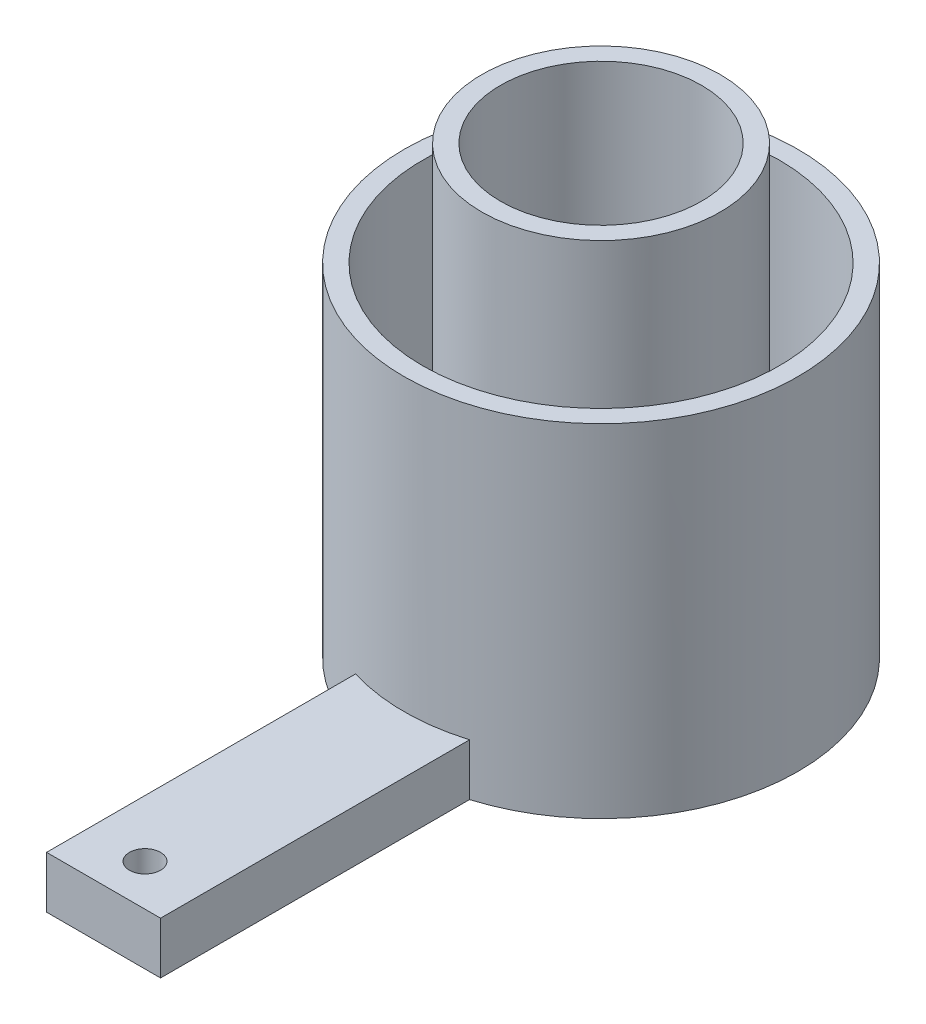
ISO-10303-21;
HEADER;
FILE_DESCRIPTION(('STEP AP214'),'2;1');
FILE_NAME('part.step','',(''),(''),'','','');
FILE_SCHEMA(('AUTOMOTIVE_DESIGN { 1 0 10303 214 1 1 1 1 }'));
ENDSEC;
DATA;
#1=APPLICATION_CONTEXT('core data for automotive mechanical design processes');
#2=APPLICATION_PROTOCOL_DEFINITION('international standard','automotive_design',2000,#1);
#3=PRODUCT_CONTEXT('',#1,'mechanical');
#4=PRODUCT('Part','Part','',(#3));
#5=PRODUCT_RELATED_PRODUCT_CATEGORY('part','',(#4));
#6=PRODUCT_DEFINITION_FORMATION('','',#4);
#7=PRODUCT_DEFINITION_CONTEXT('part definition',#1,'design');
#8=PRODUCT_DEFINITION('design','',#6,#7);
#9=PRODUCT_DEFINITION_SHAPE('','',#8);
#10=(LENGTH_UNIT() NAMED_UNIT(*) SI_UNIT(.MILLI.,.METRE.));
#11=(NAMED_UNIT(*) PLANE_ANGLE_UNIT() SI_UNIT($,.RADIAN.));
#12=(NAMED_UNIT(*) SI_UNIT($,.STERADIAN.) SOLID_ANGLE_UNIT());
#13=UNCERTAINTY_MEASURE_WITH_UNIT(LENGTH_MEASURE(1.E-05),#10,'distance_accuracy_value','');
#14=(GEOMETRIC_REPRESENTATION_CONTEXT(3) GLOBAL_UNCERTAINTY_ASSIGNED_CONTEXT((#13)) GLOBAL_UNIT_ASSIGNED_CONTEXT((#10,
#11,#12)) REPRESENTATION_CONTEXT('',''));
#15=CARTESIAN_POINT('',(0.,0.,0.));
#16=DIRECTION('',(0.,0.,1.));
#17=DIRECTION('',(1.,0.,0.));
#18=AXIS2_PLACEMENT_3D('',#15,#16,#17);
#19=CARTESIAN_POINT('',(0.,33.,0.));
#20=DIRECTION('',(0.,-1.,0.));
#21=DIRECTION('',(0.,0.,-1.));
#22=AXIS2_PLACEMENT_3D('',#19,#20,#21);
#23=CYLINDRICAL_SURFACE('',#22,17.2);
#24=CARTESIAN_POINT('',(0.,10.,0.));
#25=DIRECTION('',(0.,-1.,0.));
#26=DIRECTION('',(0.,0.,-1.));
#27=AXIS2_PLACEMENT_3D('',#24,#25,#26);
#28=CIRCLE('',#27,17.2);
#29=CARTESIAN_POINT('',(0.,10.,-17.2));
#30=VERTEX_POINT('',#29);
#31=EDGE_CURVE('E268',#30,#30,#28,.T.);
#32=ORIENTED_EDGE('',*,*,#31,.F.);
#33=EDGE_LOOP('',(#32));
#34=FACE_BOUND('',#33,.T.);
#35=CARTESIAN_POINT('',(0.,5.,0.));
#36=DIRECTION('',(0.,-1.,0.));
#37=DIRECTION('',(0.,0.,-1.));
#38=AXIS2_PLACEMENT_3D('',#35,#36,#37);
#39=CIRCLE('',#38,17.2);
#40=CARTESIAN_POINT('',(5.5,5.,16.2969322266493));
#41=VERTEX_POINT('',#40);
#42=CARTESIAN_POINT('',(-5.5,5.,16.2969322266493));
#43=VERTEX_POINT('',#42);
#44=EDGE_CURVE('E181',#41,#43,#39,.T.);
#45=ORIENTED_EDGE('',*,*,#44,.T.);
#46=DIRECTION('',(0.,-1.,0.));
#47=VECTOR('',#46,1.);
#48=CARTESIAN_POINT('',(-5.5,33.,16.2969322266493));
#49=LINE('',#48,#47);
#50=CARTESIAN_POINT('',(-5.5,0.,16.2969322266493));
#51=VERTEX_POINT('',#50);
#52=EDGE_CURVE('E189',#43,#51,#49,.T.);
#53=ORIENTED_EDGE('',*,*,#52,.T.);
#54=CARTESIAN_POINT('',(0.,0.,0.));
#55=DIRECTION('',(0.,1.,0.));
#56=DIRECTION('',(0.,0.,1.));
#57=AXIS2_PLACEMENT_3D('',#54,#55,#56);
#58=CIRCLE('',#57,17.2);
#59=CARTESIAN_POINT('',(-13.4339705934385,0.,-10.7409698861243));
#60=VERTEX_POINT('',#59);
#61=EDGE_CURVE('E269',#60,#51,#58,.T.);
#62=ORIENTED_EDGE('',*,*,#61,.F.);
#63=DIRECTION('',(0.,-1.,0.));
#64=VECTOR('',#63,1.);
#65=CARTESIAN_POINT('',(-13.4339705934385,33.,-10.7409698861243));
#66=LINE('',#65,#64);
#67=CARTESIAN_POINT('',(-13.4339705934385,2.4,-10.7409698861243));
#68=VERTEX_POINT('',#67);
#69=EDGE_CURVE('E228',#68,#60,#66,.T.);
#70=ORIENTED_EDGE('',*,*,#69,.F.);
#71=CARTESIAN_POINT('',(0.,2.4,0.));
#72=DIRECTION('',(0.,-1.,0.));
#73=DIRECTION('',(0.,0.,-1.));
#74=AXIS2_PLACEMENT_3D('',#71,#72,#73);
#75=CIRCLE('',#74,17.2);
#76=CARTESIAN_POINT('',(-6.92620660055423,2.4,-15.7438134556542));
#77=VERTEX_POINT('',#76);
#78=EDGE_CURVE('E234',#68,#77,#75,.T.);
#79=ORIENTED_EDGE('',*,*,#78,.T.);
#80=DIRECTION('',(0.,-1.,0.));
#81=VECTOR('',#80,1.);
#82=CARTESIAN_POINT('',(-6.92620660055423,33.,-15.7438134556542));
#83=LINE('',#82,#81);
#84=CARTESIAN_POINT('',(-6.92620660055423,0.,-15.7438134556542));
#85=VERTEX_POINT('',#84);
#86=EDGE_CURVE('E220',#85,#77,#83,.F.);
#87=ORIENTED_EDGE('',*,*,#86,.F.);
#88=CARTESIAN_POINT('',(5.5,0.,16.2969322266493));
#89=VERTEX_POINT('',#88);
#90=EDGE_CURVE('E260',#89,#85,#58,.T.);
#91=ORIENTED_EDGE('',*,*,#90,.F.);
#92=DIRECTION('',(0.,-1.,0.));
#93=VECTOR('',#92,1.);
#94=CARTESIAN_POINT('',(5.5,33.,16.2969322266493));
#95=LINE('',#94,#93);
#96=EDGE_CURVE('E185',#41,#89,#95,.T.);
#97=ORIENTED_EDGE('',*,*,#96,.F.);
#98=EDGE_LOOP('',(#45,#53,#62,#70,#79,#87,#91,#97));
#99=FACE_BOUND('',#98,.T.);
#100=ADVANCED_FACE('F39',(#34,#99),#23,.F.);
#101=CARTESIAN_POINT('',(0.,33.,0.));
#102=DIRECTION('',(0.,-1.,0.));
#103=DIRECTION('',(0.,0.,-1.));
#104=AXIS2_PLACEMENT_3D('',#101,#102,#103);
#105=CYLINDRICAL_SURFACE('',#104,19.);
#106=CARTESIAN_POINT('',(0.,33.,0.));
#107=DIRECTION('',(0.,1.,0.));
#108=DIRECTION('',(0.,0.,1.));
#109=AXIS2_PLACEMENT_3D('',#106,#107,#108);
#110=CIRCLE('',#109,19.);
#111=CARTESIAN_POINT('',(0.,33.,19.));
#112=VERTEX_POINT('',#111);
#113=EDGE_CURVE('E264',#112,#112,#110,.T.);
#114=ORIENTED_EDGE('',*,*,#113,.F.);
#115=EDGE_LOOP('',(#114));
#116=FACE_BOUND('',#115,.T.);
#117=DIRECTION('',(0.,-1.,0.));
#118=VECTOR('',#117,1.);
#119=CARTESIAN_POINT('',(-5.5,33.,18.1865334794732));
#120=LINE('',#119,#118);
#121=CARTESIAN_POINT('',(-5.5,5.,18.1865334794732));
#122=VERTEX_POINT('',#121);
#123=CARTESIAN_POINT('',(-5.5,0.,18.1865334794732));
#124=VERTEX_POINT('',#123);
#125=EDGE_CURVE('E54',#122,#124,#120,.T.);
#126=ORIENTED_EDGE('',*,*,#125,.F.);
#127=CARTESIAN_POINT('',(0.,5.,0.));
#128=DIRECTION('',(0.,-1.,0.));
#129=DIRECTION('',(0.,0.,-1.));
#130=AXIS2_PLACEMENT_3D('',#127,#128,#129);
#131=CIRCLE('',#130,19.);
#132=CARTESIAN_POINT('',(5.5,5.,18.1865334794732));
#133=VERTEX_POINT('',#132);
#134=EDGE_CURVE('E58',#133,#122,#131,.T.);
#135=ORIENTED_EDGE('',*,*,#134,.F.);
#136=DIRECTION('',(0.,-1.,0.));
#137=VECTOR('',#136,1.);
#138=CARTESIAN_POINT('',(5.5,33.,18.1865334794732));
#139=LINE('',#138,#137);
#140=CARTESIAN_POINT('',(5.5,0.,18.1865334794732));
#141=VERTEX_POINT('',#140);
#142=EDGE_CURVE('E158',#133,#141,#139,.T.);
#143=ORIENTED_EDGE('',*,*,#142,.T.);
#144=CARTESIAN_POINT('',(0.,0.,0.));
#145=DIRECTION('',(0.,1.,0.));
#146=DIRECTION('',(0.,0.,1.));
#147=AXIS2_PLACEMENT_3D('',#144,#145,#146);
#148=CIRCLE('',#147,19.);
#149=EDGE_CURVE('E265',#141,#124,#148,.T.);
#150=ORIENTED_EDGE('',*,*,#149,.T.);
#151=EDGE_LOOP('',(#126,#135,#143,#150));
#152=FACE_BOUND('',#151,.T.);
#153=ADVANCED_FACE('F322',(#116,#152),#105,.T.);
#154=CARTESIAN_POINT('',(0.,43.,0.));
#155=DIRECTION('',(0.,-1.,0.));
#156=DIRECTION('',(0.,0.,-1.));
#157=AXIS2_PLACEMENT_3D('',#154,#155,#156);
#158=CYLINDRICAL_SURFACE('',#157,11.5);
#159=CARTESIAN_POINT('',(0.,10.,0.));
#160=DIRECTION('',(0.,-1.,0.));
#161=DIRECTION('',(0.,0.,-1.));
#162=AXIS2_PLACEMENT_3D('',#159,#160,#161);
#163=CIRCLE('',#162,11.5);
#164=CARTESIAN_POINT('',(0.,10.,-11.5));
#165=VERTEX_POINT('',#164);
#166=EDGE_CURVE('E245',#165,#165,#163,.F.);
#167=ORIENTED_EDGE('',*,*,#166,.F.);
#168=EDGE_LOOP('',(#167));
#169=FACE_BOUND('',#168,.T.);
#170=DIRECTION('',(0.,-1.,0.));
#171=VECTOR('',#170,1.);
#172=CARTESIAN_POINT('',(-5.5,43.,10.0995049383621));
#173=LINE('',#172,#171);
#174=CARTESIAN_POINT('',(-5.5,5.,10.0995049383621));
#175=VERTEX_POINT('',#174);
#176=CARTESIAN_POINT('',(-5.5,0.,10.0995049383621));
#177=VERTEX_POINT('',#176);
#178=EDGE_CURVE('E11',#175,#177,#173,.T.);
#179=ORIENTED_EDGE('',*,*,#178,.F.);
#180=CARTESIAN_POINT('',(0.,5.,0.));
#181=DIRECTION('',(0.,-1.,0.));
#182=DIRECTION('',(0.,0.,-1.));
#183=AXIS2_PLACEMENT_3D('',#180,#181,#182);
#184=CIRCLE('',#183,11.5);
#185=CARTESIAN_POINT('',(5.5,5.,10.0995049383621));
#186=VERTEX_POINT('',#185);
#187=EDGE_CURVE('E281',#186,#175,#184,.T.);
#188=ORIENTED_EDGE('',*,*,#187,.F.);
#189=DIRECTION('',(0.,-1.,0.));
#190=VECTOR('',#189,1.);
#191=CARTESIAN_POINT('',(5.5,43.,10.0995049383621));
#192=LINE('',#191,#190);
#193=CARTESIAN_POINT('',(5.5,0.,10.0995049383621));
#194=VERTEX_POINT('',#193);
#195=EDGE_CURVE('E47',#186,#194,#192,.T.);
#196=ORIENTED_EDGE('',*,*,#195,.T.);
#197=CARTESIAN_POINT('',(0.,0.,0.));
#198=DIRECTION('',(0.,1.,0.));
#199=DIRECTION('',(0.,0.,1.));
#200=AXIS2_PLACEMENT_3D('',#197,#198,#199);
#201=CIRCLE('',#200,11.5);
#202=CARTESIAN_POINT('',(-5.01101741859494,0.,-10.3508310985417));
#203=VERTEX_POINT('',#202);
#204=EDGE_CURVE('E247',#194,#203,#201,.T.);
#205=ORIENTED_EDGE('',*,*,#204,.T.);
#206=DIRECTION('',(0.,-1.,0.));
#207=VECTOR('',#206,1.);
#208=CARTESIAN_POINT('',(-5.01101741859494,43.,-10.3508310985417));
#209=LINE('',#208,#207);
#210=CARTESIAN_POINT('',(-5.01101741859494,2.4,-10.3508310985417));
#211=VERTEX_POINT('',#210);
#212=EDGE_CURVE('E214',#203,#211,#209,.F.);
#213=ORIENTED_EDGE('',*,*,#212,.T.);
#214=CARTESIAN_POINT('',(0.,2.4,0.));
#215=DIRECTION('',(0.,-1.,0.));
#216=DIRECTION('',(0.,0.,-1.));
#217=AXIS2_PLACEMENT_3D('',#214,#215,#216);
#218=CIRCLE('',#217,11.5);
#219=CARTESIAN_POINT('',(-8.71463450240619,2.4,-7.50367546536173));
#220=VERTEX_POINT('',#219);
#221=EDGE_CURVE('E255',#220,#211,#218,.T.);
#222=ORIENTED_EDGE('',*,*,#221,.F.);
#223=DIRECTION('',(0.,-1.,0.));
#224=VECTOR('',#223,1.);
#225=CARTESIAN_POINT('',(-8.71463450240619,43.,-7.50367546536173));
#226=LINE('',#225,#224);
#227=CARTESIAN_POINT('',(-8.71463450240619,0.,-7.50367546536173));
#228=VERTEX_POINT('',#227);
#229=EDGE_CURVE('E222',#220,#228,#226,.T.);
#230=ORIENTED_EDGE('',*,*,#229,.T.);
#231=EDGE_CURVE('E242',#228,#177,#201,.T.);
#232=ORIENTED_EDGE('',*,*,#231,.T.);
#233=EDGE_LOOP('',(#179,#188,#196,#205,#213,#222,#230,#232));
#234=FACE_BOUND('',#233,.T.);
#235=ADVANCED_FACE('F288',(#169,#234),#158,.T.);
#236=CARTESIAN_POINT('',(0.,33.,0.));
#237=DIRECTION('',(0.,1.,0.));
#238=DIRECTION('',(0.,0.,1.));
#239=AXIS2_PLACEMENT_3D('',#236,#237,#238);
#240=CIRCLE('',#239,17.2);
#241=CARTESIAN_POINT('',(0.,33.,17.2));
#242=VERTEX_POINT('',#241);
#243=EDGE_CURVE('E261',#242,#242,#240,.T.);
#244=ORIENTED_EDGE('',*,*,#243,.T.);
#245=EDGE_LOOP('',(#244));
#246=FACE_BOUND('',#245,.T.);
#247=CARTESIAN_POINT('',(0.,13.,0.));
#248=DIRECTION('',(0.,-1.,0.));
#249=DIRECTION('',(0.,0.,-1.));
#250=AXIS2_PLACEMENT_3D('',#247,#248,#249);
#251=CIRCLE('',#250,17.2);
#252=CARTESIAN_POINT('',(0.,13.,-17.2));
#253=VERTEX_POINT('',#252);
#254=EDGE_CURVE('E257',#253,#253,#251,.T.);
#255=ORIENTED_EDGE('',*,*,#254,.T.);
#256=EDGE_LOOP('',(#255));
#257=FACE_BOUND('',#256,.T.);
#258=ADVANCED_FACE('F324',(#246,#257),#23,.F.);
#259=CARTESIAN_POINT('',(0.,33.,0.));
#260=DIRECTION('',(0.,1.,0.));
#261=DIRECTION('',(0.,0.,1.));
#262=AXIS2_PLACEMENT_3D('',#259,#260,#261);
#263=PLANE('',#262);
#264=ORIENTED_EDGE('',*,*,#243,.F.);
#265=EDGE_LOOP('',(#264));
#266=FACE_BOUND('',#265,.T.);
#267=ORIENTED_EDGE('',*,*,#113,.T.);
#268=EDGE_LOOP('',(#267));
#269=FACE_BOUND('',#268,.T.);
#270=ADVANCED_FACE('F332',(#266,#269),#263,.T.);
#271=CARTESIAN_POINT('',(0.,0.,0.));
#272=DIRECTION('',(0.,1.,0.));
#273=DIRECTION('',(0.,0.,1.));
#274=AXIS2_PLACEMENT_3D('',#271,#272,#273);
#275=PLANE('',#274);
#276=CARTESIAN_POINT('',(0.,0.,44.));
#277=DIRECTION('',(0.,-1.,0.));
#278=DIRECTION('',(0.,0.,-1.));
#279=AXIS2_PLACEMENT_3D('',#276,#277,#278);
#280=CIRCLE('',#279,1.5);
#281=CARTESIAN_POINT('',(0.,0.,42.5));
#282=VERTEX_POINT('',#281);
#283=EDGE_CURVE('E305',#282,#282,#280,.T.);
#284=ORIENTED_EDGE('',*,*,#283,.F.);
#285=EDGE_LOOP('',(#284));
#286=FACE_BOUND('',#285,.T.);
#287=ORIENTED_EDGE('',*,*,#61,.T.);
#288=DIRECTION('',(0.,0.,1.));
#289=VECTOR('',#288,1.);
#290=CARTESIAN_POINT('',(-5.5,0.,0.));
#291=LINE('',#290,#289);
#292=EDGE_CURVE('E300',#177,#51,#291,.T.);
#293=ORIENTED_EDGE('',*,*,#292,.F.);
#294=ORIENTED_EDGE('',*,*,#231,.F.);
#295=DIRECTION('',(-0.824632815792926,0.,-0.565668382639006));
#296=VECTOR('',#295,1.);
#297=CARTESIAN_POINT('',(-14.9219179053918,0.,-11.7616480998518));
#298=LINE('',#297,#296);
#299=EDGE_CURVE('E210',#228,#60,#298,.T.);
#300=ORIENTED_EDGE('',*,*,#299,.T.);
#301=EDGE_LOOP('',(#287,#293,#294,#300));
#302=FACE_BOUND('',#301,.T.);
#303=DIRECTION('',(0.,0.,1.));
#304=VECTOR('',#303,1.);
#305=CARTESIAN_POINT('',(5.5,0.,0.));
#306=LINE('',#305,#304);
#307=EDGE_CURVE('E293',#194,#89,#306,.T.);
#308=ORIENTED_EDGE('',*,*,#307,.T.);
#309=ORIENTED_EDGE('',*,*,#90,.T.);
#310=DIRECTION('',(0.334650429092405,0.,0.942342342415042));
#311=VECTOR('',#310,1.);
#312=CARTESIAN_POINT('',(-3.56545480144874,0.,-6.28027046473769));
#313=LINE('',#312,#311);
#314=EDGE_CURVE('E206',#85,#203,#313,.T.);
#315=ORIENTED_EDGE('',*,*,#314,.T.);
#316=ORIENTED_EDGE('',*,*,#204,.F.);
#317=EDGE_LOOP('',(#308,#309,#315,#316));
#318=FACE_BOUND('',#317,.T.);
#319=CARTESIAN_POINT('',(0.,0.,0.));
#320=DIRECTION('',(0.,1.,0.));
#321=DIRECTION('',(0.,0.,1.));
#322=AXIS2_PLACEMENT_3D('',#319,#320,#321);
#323=CIRCLE('',#322,9.7);
#324=CARTESIAN_POINT('',(-7.21964860347408,0.,-6.47816903471611));
#325=VERTEX_POINT('',#324);
#326=CARTESIAN_POINT('',(-4.40432597607253,0.,-8.64244830453112));
#327=VERTEX_POINT('',#326);
#328=EDGE_CURVE('E237',#325,#327,#323,.T.);
#329=ORIENTED_EDGE('',*,*,#328,.T.);
#330=CARTESIAN_POINT('',(-3.56545480144874,0.,-6.28027046473769));
#331=VERTEX_POINT('',#330);
#332=EDGE_CURVE('E192',#327,#331,#313,.T.);
#333=ORIENTED_EDGE('',*,*,#332,.T.);
#334=DIRECTION('',(-0.792808155570245,0.,0.609471269594642));
#335=VECTOR('',#334,1.);
#336=CARTESIAN_POINT('',(-5.1525342695895,0.,-5.06020312360444));
#337=LINE('',#336,#335);
#338=CARTESIAN_POINT('',(-5.1525342695895,0.,-5.06020312360444));
#339=VERTEX_POINT('',#338);
#340=EDGE_CURVE('E207',#331,#339,#337,.T.);
#341=ORIENTED_EDGE('',*,*,#340,.T.);
#342=EDGE_CURVE('E196',#339,#325,#298,.T.);
#343=ORIENTED_EDGE('',*,*,#342,.T.);
#344=EDGE_LOOP('',(#329,#333,#341,#343));
#345=FACE_BOUND('',#344,.T.);
#346=ORIENTED_EDGE('',*,*,#149,.F.);
#347=CARTESIAN_POINT('',(5.5,0.,48.));
#348=VERTEX_POINT('',#347);
#349=EDGE_CURVE('E298',#141,#348,#306,.T.);
#350=ORIENTED_EDGE('',*,*,#349,.T.);
#351=DIRECTION('',(1.,0.,0.));
#352=VECTOR('',#351,1.);
#353=CARTESIAN_POINT('',(0.,0.,48.));
#354=LINE('',#353,#352);
#355=CARTESIAN_POINT('',(-5.5,0.,48.));
#356=VERTEX_POINT('',#355);
#357=EDGE_CURVE('E174',#356,#348,#354,.T.);
#358=ORIENTED_EDGE('',*,*,#357,.F.);
#359=EDGE_CURVE('E302',#124,#356,#291,.T.);
#360=ORIENTED_EDGE('',*,*,#359,.F.);
#361=EDGE_LOOP('',(#346,#350,#358,#360));
#362=FACE_BOUND('',#361,.T.);
#363=ADVANCED_FACE('F338',(#286,#302,#318,#345,#362),#275,.F.);
#364=CARTESIAN_POINT('',(0.,10.,0.));
#365=DIRECTION('',(0.,-1.,0.));
#366=DIRECTION('',(0.,0.,-1.));
#367=AXIS2_PLACEMENT_3D('',#364,#365,#366);
#368=PLANE('',#367);
#369=ORIENTED_EDGE('',*,*,#166,.T.);
#370=EDGE_LOOP('',(#369));
#371=FACE_BOUND('',#370,.T.);
#372=ORIENTED_EDGE('',*,*,#31,.T.);
#373=EDGE_LOOP('',(#372));
#374=FACE_BOUND('',#373,.T.);
#375=ADVANCED_FACE('F351',(#371,#374),#368,.T.);
#376=CARTESIAN_POINT('',(0.,13.,0.));
#377=DIRECTION('',(0.,-1.,0.));
#378=DIRECTION('',(0.,0.,-1.));
#379=AXIS2_PLACEMENT_3D('',#376,#377,#378);
#380=PLANE('',#379);
#381=CARTESIAN_POINT('',(0.,13.,0.));
#382=DIRECTION('',(0.,-1.,0.));
#383=DIRECTION('',(0.,0.,-1.));
#384=AXIS2_PLACEMENT_3D('',#381,#382,#383);
#385=CIRCLE('',#384,11.5);
#386=CARTESIAN_POINT('',(0.,13.,-11.5));
#387=VERTEX_POINT('',#386);
#388=EDGE_CURVE('E256',#387,#387,#385,.F.);
#389=ORIENTED_EDGE('',*,*,#388,.F.);
#390=EDGE_LOOP('',(#389));
#391=FACE_BOUND('',#390,.T.);
#392=ORIENTED_EDGE('',*,*,#254,.F.);
#393=EDGE_LOOP('',(#392));
#394=FACE_BOUND('',#393,.T.);
#395=ADVANCED_FACE('F348',(#391,#394),#380,.F.);
#396=CARTESIAN_POINT('',(0.,43.,0.));
#397=DIRECTION('',(0.,-1.,0.));
#398=DIRECTION('',(0.,0.,-1.));
#399=AXIS2_PLACEMENT_3D('',#396,#397,#398);
#400=CYLINDRICAL_SURFACE('',#399,9.7);
#401=CARTESIAN_POINT('',(0.,43.,0.));
#402=DIRECTION('',(0.,1.,0.));
#403=DIRECTION('',(0.,0.,1.));
#404=AXIS2_PLACEMENT_3D('',#401,#402,#403);
#405=CIRCLE('',#404,9.7);
#406=CARTESIAN_POINT('',(0.,43.,9.7));
#407=VERTEX_POINT('',#406);
#408=EDGE_CURVE('E238',#407,#407,#405,.T.);
#409=ORIENTED_EDGE('',*,*,#408,.T.);
#410=EDGE_LOOP('',(#409));
#411=FACE_BOUND('',#410,.T.);
#412=CARTESIAN_POINT('',(0.,13.,0.));
#413=DIRECTION('',(0.,-1.,0.));
#414=DIRECTION('',(0.,0.,-1.));
#415=AXIS2_PLACEMENT_3D('',#412,#413,#414);
#416=CIRCLE('',#415,9.7);
#417=CARTESIAN_POINT('',(0.,13.,-9.7));
#418=VERTEX_POINT('',#417);
#419=EDGE_CURVE('E251',#418,#418,#416,.F.);
#420=ORIENTED_EDGE('',*,*,#419,.F.);
#421=EDGE_LOOP('',(#420));
#422=FACE_BOUND('',#421,.T.);
#423=ADVANCED_FACE('F350',(#411,#422),#400,.F.);
#424=CARTESIAN_POINT('',(0.,43.,0.));
#425=DIRECTION('',(0.,1.,0.));
#426=DIRECTION('',(0.,0.,1.));
#427=AXIS2_PLACEMENT_3D('',#424,#425,#426);
#428=PLANE('',#427);
#429=ORIENTED_EDGE('',*,*,#408,.F.);
#430=EDGE_LOOP('',(#429));
#431=FACE_BOUND('',#430,.T.);
#432=CARTESIAN_POINT('',(0.,43.,0.));
#433=DIRECTION('',(0.,1.,0.));
#434=DIRECTION('',(0.,0.,1.));
#435=AXIS2_PLACEMENT_3D('',#432,#433,#434);
#436=CIRCLE('',#435,11.5);
#437=CARTESIAN_POINT('',(0.,43.,11.5));
#438=VERTEX_POINT('',#437);
#439=EDGE_CURVE('E241',#438,#438,#436,.T.);
#440=ORIENTED_EDGE('',*,*,#439,.T.);
#441=EDGE_LOOP('',(#440));
#442=FACE_BOUND('',#441,.T.);
#443=ADVANCED_FACE('F359',(#431,#442),#428,.T.);
#444=ORIENTED_EDGE('',*,*,#439,.F.);
#445=EDGE_LOOP('',(#444));
#446=FACE_BOUND('',#445,.T.);
#447=ORIENTED_EDGE('',*,*,#388,.T.);
#448=EDGE_LOOP('',(#447));
#449=FACE_BOUND('',#448,.T.);
#450=ADVANCED_FACE('F343',(#446,#449),#158,.T.);
#451=ORIENTED_EDGE('',*,*,#419,.T.);
#452=EDGE_LOOP('',(#451));
#453=FACE_BOUND('',#452,.T.);
#454=ADVANCED_FACE('F354',(#453),#380,.F.);
#455=DIRECTION('',(0.,-1.,0.));
#456=VECTOR('',#455,1.);
#457=CARTESIAN_POINT('',(-4.40432597607253,43.,-8.64244830453112));
#458=LINE('',#457,#456);
#459=CARTESIAN_POINT('',(-4.40432597607253,2.4,-8.64244830453112));
#460=VERTEX_POINT('',#459);
#461=EDGE_CURVE('E218',#327,#460,#458,.F.);
#462=ORIENTED_EDGE('',*,*,#461,.F.);
#463=ORIENTED_EDGE('',*,*,#328,.F.);
#464=DIRECTION('',(0.,-1.,0.));
#465=VECTOR('',#464,1.);
#466=CARTESIAN_POINT('',(-7.21964860347408,43.,-6.47816903471611));
#467=LINE('',#466,#465);
#468=CARTESIAN_POINT('',(-7.21964860347408,2.4,-6.47816903471611));
#469=VERTEX_POINT('',#468);
#470=EDGE_CURVE('E225',#469,#325,#467,.T.);
#471=ORIENTED_EDGE('',*,*,#470,.F.);
#472=CARTESIAN_POINT('',(0.,2.4,0.));
#473=DIRECTION('',(0.,-1.,0.));
#474=DIRECTION('',(0.,0.,-1.));
#475=AXIS2_PLACEMENT_3D('',#472,#473,#474);
#476=CIRCLE('',#475,9.7);
#477=EDGE_CURVE('E231',#469,#460,#476,.T.);
#478=ORIENTED_EDGE('',*,*,#477,.T.);
#479=EDGE_LOOP('',(#462,#463,#471,#478));
#480=FACE_BOUND('',#479,.T.);
#481=CARTESIAN_POINT('',(0.,10.,0.));
#482=DIRECTION('',(0.,-1.,0.));
#483=DIRECTION('',(0.,0.,-1.));
#484=AXIS2_PLACEMENT_3D('',#481,#482,#483);
#485=CIRCLE('',#484,9.7);
#486=CARTESIAN_POINT('',(0.,10.,-9.7));
#487=VERTEX_POINT('',#486);
#488=EDGE_CURVE('E252',#487,#487,#485,.F.);
#489=ORIENTED_EDGE('',*,*,#488,.T.);
#490=EDGE_LOOP('',(#489));
#491=FACE_BOUND('',#490,.T.);
#492=ADVANCED_FACE('F362',(#480,#491),#400,.F.);
#493=ORIENTED_EDGE('',*,*,#488,.F.);
#494=EDGE_LOOP('',(#493));
#495=FACE_BOUND('',#494,.T.);
#496=ADVANCED_FACE('F365',(#495),#368,.T.);
#497=CARTESIAN_POINT('',(0.,2.4,0.));
#498=DIRECTION('',(0.,-1.,0.));
#499=DIRECTION('',(0.,0.,-1.));
#500=AXIS2_PLACEMENT_3D('',#497,#498,#499);
#501=PLANE('',#500);
#502=ORIENTED_EDGE('',*,*,#78,.F.);
#503=DIRECTION('',(-0.824632815792926,0.,-0.565668382639006));
#504=VECTOR('',#503,1.);
#505=CARTESIAN_POINT('',(-14.9219179053918,2.4,-11.7616480998518));
#506=LINE('',#505,#504);
#507=EDGE_CURVE('E200',#220,#68,#506,.T.);
#508=ORIENTED_EDGE('',*,*,#507,.F.);
#509=ORIENTED_EDGE('',*,*,#221,.T.);
#510=DIRECTION('',(0.334650429092405,0.,0.942342342415042));
#511=VECTOR('',#510,1.);
#512=CARTESIAN_POINT('',(-3.56545480144874,2.4,-6.28027046473769));
#513=LINE('',#512,#511);
#514=EDGE_CURVE('E195',#77,#211,#513,.T.);
#515=ORIENTED_EDGE('',*,*,#514,.F.);
#516=EDGE_LOOP('',(#502,#508,#509,#515));
#517=FACE_BOUND('',#516,.T.);
#518=ADVANCED_FACE('F400',(#517),#501,.F.);
#519=CARTESIAN_POINT('',(-3.56545480144874,2.4,-6.28027046473769));
#520=DIRECTION('',(0.942342342415042,0.,-0.334650429092405));
#521=DIRECTION('',(-0.334650429092405,0.,-0.942342342415043));
#522=AXIS2_PLACEMENT_3D('',#519,#520,#521);
#523=PLANE('',#522);
#524=ORIENTED_EDGE('',*,*,#314,.F.);
#525=ORIENTED_EDGE('',*,*,#86,.T.);
#526=ORIENTED_EDGE('',*,*,#514,.T.);
#527=ORIENTED_EDGE('',*,*,#212,.F.);
#528=EDGE_LOOP('',(#524,#525,#526,#527));
#529=FACE_BOUND('',#528,.T.);
#530=ADVANCED_FACE('F390',(#529),#523,.T.);
#531=CARTESIAN_POINT('',(-14.9219179053918,2.4,-11.7616480998518));
#532=DIRECTION('',(-0.565668382639006,0.,0.824632815792926));
#533=DIRECTION('',(0.824632815792926,0.,0.565668382639006));
#534=AXIS2_PLACEMENT_3D('',#531,#532,#533);
#535=PLANE('',#534);
#536=ORIENTED_EDGE('',*,*,#507,.T.);
#537=ORIENTED_EDGE('',*,*,#69,.T.);
#538=ORIENTED_EDGE('',*,*,#299,.F.);
#539=ORIENTED_EDGE('',*,*,#229,.F.);
#540=EDGE_LOOP('',(#536,#537,#538,#539));
#541=FACE_BOUND('',#540,.T.);
#542=ADVANCED_FACE('F399',(#541),#535,.T.);
#543=ORIENTED_EDGE('',*,*,#477,.F.);
#544=CARTESIAN_POINT('',(-5.1525342695895,2.4,-5.06020312360444));
#545=VERTEX_POINT('',#544);
#546=EDGE_CURVE('E201',#545,#469,#506,.T.);
#547=ORIENTED_EDGE('',*,*,#546,.F.);
#548=DIRECTION('',(-0.792808155570245,0.,0.609471269594642));
#549=VECTOR('',#548,1.);
#550=CARTESIAN_POINT('',(-5.1525342695895,2.4,-5.06020312360444));
#551=LINE('',#550,#549);
#552=CARTESIAN_POINT('',(-3.56545480144874,2.4,-6.28027046473769));
#553=VERTEX_POINT('',#552);
#554=EDGE_CURVE('E197',#553,#545,#551,.T.);
#555=ORIENTED_EDGE('',*,*,#554,.F.);
#556=EDGE_CURVE('E193',#460,#553,#513,.T.);
#557=ORIENTED_EDGE('',*,*,#556,.F.);
#558=EDGE_LOOP('',(#543,#547,#555,#557));
#559=FACE_BOUND('',#558,.T.);
#560=ADVANCED_FACE('F397',(#559),#501,.F.);
#561=ORIENTED_EDGE('',*,*,#546,.T.);
#562=ORIENTED_EDGE('',*,*,#470,.T.);
#563=ORIENTED_EDGE('',*,*,#342,.F.);
#564=DIRECTION('',(0.,-1.,0.));
#565=VECTOR('',#564,1.);
#566=CARTESIAN_POINT('',(-5.1525342695895,2.4,-5.06020312360444));
#567=LINE('',#566,#565);
#568=EDGE_CURVE('E212',#545,#339,#567,.T.);
#569=ORIENTED_EDGE('',*,*,#568,.F.);
#570=EDGE_LOOP('',(#561,#562,#563,#569));
#571=FACE_BOUND('',#570,.T.);
#572=ADVANCED_FACE('F393',(#571),#535,.T.);
#573=CARTESIAN_POINT('',(-5.1525342695895,2.4,-5.06020312360444));
#574=DIRECTION('',(0.609471269594643,0.,0.792808155570246));
#575=DIRECTION('',(0.792808155570246,0.,-0.609471269594643));
#576=AXIS2_PLACEMENT_3D('',#573,#574,#575);
#577=PLANE('',#576);
#578=ORIENTED_EDGE('',*,*,#340,.F.);
#579=DIRECTION('',(0.,-1.,0.));
#580=VECTOR('',#579,1.);
#581=CARTESIAN_POINT('',(-3.56545480144874,2.4,-6.28027046473769));
#582=LINE('',#581,#580);
#583=EDGE_CURVE('E204',#553,#331,#582,.T.);
#584=ORIENTED_EDGE('',*,*,#583,.F.);
#585=ORIENTED_EDGE('',*,*,#554,.T.);
#586=ORIENTED_EDGE('',*,*,#568,.T.);
#587=EDGE_LOOP('',(#578,#584,#585,#586));
#588=FACE_BOUND('',#587,.T.);
#589=ADVANCED_FACE('F388',(#588),#577,.T.);
#590=ORIENTED_EDGE('',*,*,#332,.F.);
#591=ORIENTED_EDGE('',*,*,#461,.T.);
#592=ORIENTED_EDGE('',*,*,#556,.T.);
#593=ORIENTED_EDGE('',*,*,#583,.T.);
#594=EDGE_LOOP('',(#590,#591,#592,#593));
#595=FACE_BOUND('',#594,.T.);
#596=ADVANCED_FACE('F385',(#595),#523,.T.);
#597=CARTESIAN_POINT('',(0.,5.,0.));
#598=DIRECTION('',(0.,-1.,0.));
#599=DIRECTION('',(0.,0.,-1.));
#600=AXIS2_PLACEMENT_3D('',#597,#598,#599);
#601=PLANE('',#600);
#602=ORIENTED_EDGE('',*,*,#44,.F.);
#603=DIRECTION('',(0.,0.,1.));
#604=VECTOR('',#603,1.);
#605=CARTESIAN_POINT('',(5.5,5.,0.));
#606=LINE('',#605,#604);
#607=EDGE_CURVE('E160',#186,#41,#606,.T.);
#608=ORIENTED_EDGE('',*,*,#607,.F.);
#609=ORIENTED_EDGE('',*,*,#187,.T.);
#610=DIRECTION('',(0.,0.,1.));
#611=VECTOR('',#610,1.);
#612=CARTESIAN_POINT('',(-5.5,5.,0.));
#613=LINE('',#612,#611);
#614=EDGE_CURVE('E161',#175,#43,#613,.T.);
#615=ORIENTED_EDGE('',*,*,#614,.T.);
#616=EDGE_LOOP('',(#602,#608,#609,#615));
#617=FACE_BOUND('',#616,.T.);
#618=ADVANCED_FACE('F320',(#617),#601,.F.);
#619=CARTESIAN_POINT('',(5.5,5.,0.));
#620=DIRECTION('',(1.,0.,0.));
#621=DIRECTION('',(0.,0.,-1.));
#622=AXIS2_PLACEMENT_3D('',#619,#620,#621);
#623=PLANE('',#622);
#624=ORIENTED_EDGE('',*,*,#607,.T.);
#625=ORIENTED_EDGE('',*,*,#96,.T.);
#626=ORIENTED_EDGE('',*,*,#307,.F.);
#627=ORIENTED_EDGE('',*,*,#195,.F.);
#628=EDGE_LOOP('',(#624,#625,#626,#627));
#629=FACE_BOUND('',#628,.T.);
#630=ADVANCED_FACE('F294',(#629),#623,.T.);
#631=CARTESIAN_POINT('',(-5.5,5.,0.));
#632=DIRECTION('',(1.,0.,0.));
#633=DIRECTION('',(0.,0.,-1.));
#634=AXIS2_PLACEMENT_3D('',#631,#632,#633);
#635=PLANE('',#634);
#636=ORIENTED_EDGE('',*,*,#52,.F.);
#637=ORIENTED_EDGE('',*,*,#614,.F.);
#638=ORIENTED_EDGE('',*,*,#178,.T.);
#639=ORIENTED_EDGE('',*,*,#292,.T.);
#640=EDGE_LOOP('',(#636,#637,#638,#639));
#641=FACE_BOUND('',#640,.T.);
#642=ADVANCED_FACE('F407',(#641),#635,.F.);
#643=CARTESIAN_POINT('',(-5.5,5.,48.));
#644=VERTEX_POINT('',#643);
#645=EDGE_CURVE('E167',#122,#644,#613,.T.);
#646=ORIENTED_EDGE('',*,*,#645,.F.);
#647=ORIENTED_EDGE('',*,*,#125,.T.);
#648=ORIENTED_EDGE('',*,*,#359,.T.);
#649=DIRECTION('',(0.,-1.,0.));
#650=VECTOR('',#649,1.);
#651=CARTESIAN_POINT('',(-5.5,5.,48.));
#652=LINE('',#651,#650);
#653=EDGE_CURVE('E175',#644,#356,#652,.T.);
#654=ORIENTED_EDGE('',*,*,#653,.F.);
#655=EDGE_LOOP('',(#646,#647,#648,#654));
#656=FACE_BOUND('',#655,.T.);
#657=ADVANCED_FACE('F404',(#656),#635,.F.);
#658=ORIENTED_EDGE('',*,*,#142,.F.);
#659=CARTESIAN_POINT('',(5.5,5.,48.));
#660=VERTEX_POINT('',#659);
#661=EDGE_CURVE('E151',#133,#660,#606,.T.);
#662=ORIENTED_EDGE('',*,*,#661,.T.);
#663=DIRECTION('',(0.,-1.,0.));
#664=VECTOR('',#663,1.);
#665=CARTESIAN_POINT('',(5.5,5.,48.));
#666=LINE('',#665,#664);
#667=EDGE_CURVE('E156',#660,#348,#666,.T.);
#668=ORIENTED_EDGE('',*,*,#667,.T.);
#669=ORIENTED_EDGE('',*,*,#349,.F.);
#670=EDGE_LOOP('',(#658,#662,#668,#669));
#671=FACE_BOUND('',#670,.T.);
#672=ADVANCED_FACE('F153',(#671),#623,.T.);
#673=CARTESIAN_POINT('',(0.,5.,48.));
#674=DIRECTION('',(0.,0.,-1.));
#675=DIRECTION('',(-1.,0.,0.));
#676=AXIS2_PLACEMENT_3D('',#673,#674,#675);
#677=PLANE('',#676);
#678=ORIENTED_EDGE('',*,*,#357,.T.);
#679=ORIENTED_EDGE('',*,*,#667,.F.);
#680=DIRECTION('',(1.,0.,0.));
#681=VECTOR('',#680,1.);
#682=CARTESIAN_POINT('',(0.,5.,48.));
#683=LINE('',#682,#681);
#684=EDGE_CURVE('E164',#644,#660,#683,.T.);
#685=ORIENTED_EDGE('',*,*,#684,.F.);
#686=ORIENTED_EDGE('',*,*,#653,.T.);
#687=EDGE_LOOP('',(#678,#679,#685,#686));
#688=FACE_BOUND('',#687,.T.);
#689=ADVANCED_FACE('F172',(#688),#677,.F.);
#690=CARTESIAN_POINT('',(0.,5.,44.));
#691=DIRECTION('',(0.,-1.,0.));
#692=DIRECTION('',(0.,0.,-1.));
#693=AXIS2_PLACEMENT_3D('',#690,#691,#692);
#694=CIRCLE('',#693,1.5);
#695=CARTESIAN_POINT('',(0.,5.,42.5));
#696=VERTEX_POINT('',#695);
#697=EDGE_CURVE('E42',#696,#696,#694,.T.);
#698=ORIENTED_EDGE('',*,*,#697,.T.);
#699=EDGE_LOOP('',(#698));
#700=FACE_BOUND('',#699,.T.);
#701=ORIENTED_EDGE('',*,*,#661,.F.);
#702=ORIENTED_EDGE('',*,*,#134,.T.);
#703=ORIENTED_EDGE('',*,*,#645,.T.);
#704=ORIENTED_EDGE('',*,*,#684,.T.);
#705=EDGE_LOOP('',(#701,#702,#703,#704));
#706=FACE_BOUND('',#705,.T.);
#707=ADVANCED_FACE('F165',(#700,#706),#601,.F.);
#708=CARTESIAN_POINT('',(0.,43.,44.));
#709=DIRECTION('',(0.,-1.,0.));
#710=DIRECTION('',(0.,0.,-1.));
#711=AXIS2_PLACEMENT_3D('',#708,#709,#710);
#712=CYLINDRICAL_SURFACE('',#711,1.5);
#713=ORIENTED_EDGE('',*,*,#283,.T.);
#714=EDGE_LOOP('',(#713));
#715=FACE_BOUND('',#714,.T.);
#716=ORIENTED_EDGE('',*,*,#697,.F.);
#717=EDGE_LOOP('',(#716));
#718=FACE_BOUND('',#717,.T.);
#719=ADVANCED_FACE('F313',(#715,#718),#712,.F.);
#720=CLOSED_SHELL('',(#100,#153,#235,#258,#270,#363,#375,#395,#423,#443,#450,#454,#492,#496,
#518,#530,#542,#560,#572,#589,#596,#618,#630,#642,#657,#672,#689,#707,#719));
#721=MANIFOLD_SOLID_BREP('B2',#720);
#722=ADVANCED_BREP_SHAPE_REPRESENTATION('',(#18,#721),#14);
#723=SHAPE_DEFINITION_REPRESENTATION(#9,#722);
ENDSEC;
END-ISO-10303-21;
